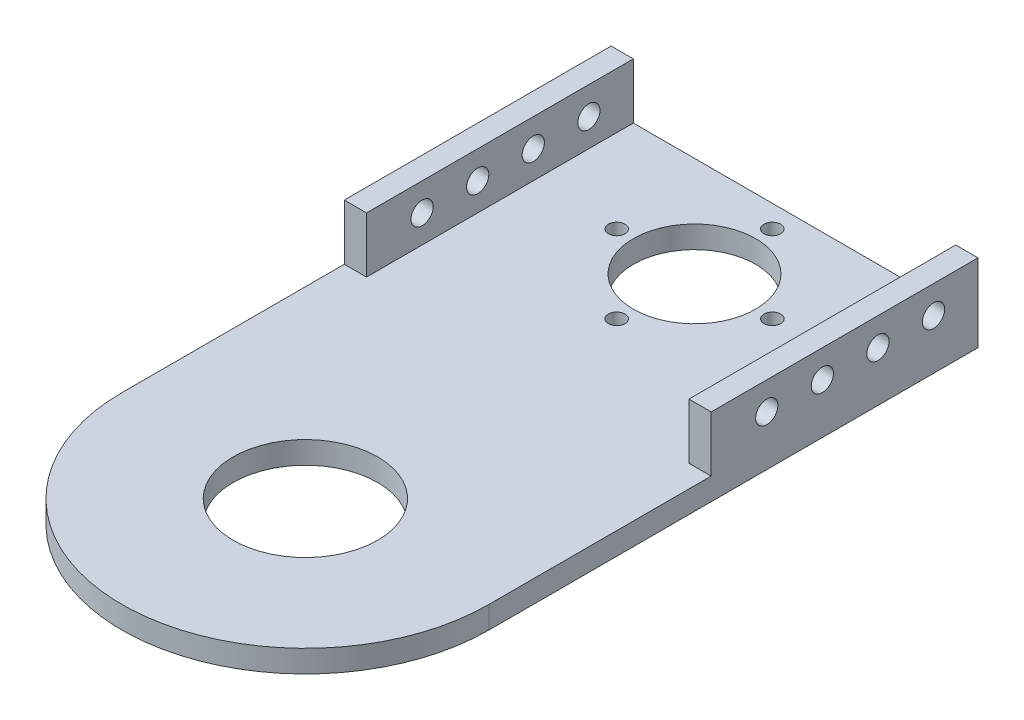
ISO-10303-21;
HEADER;
FILE_DESCRIPTION(('STEP AP214'),'2;1');
FILE_NAME('part.step','',(''),(''),'','','');
FILE_SCHEMA(('AUTOMOTIVE_DESIGN { 1 0 10303 214 1 1 1 1 }'));
ENDSEC;
DATA;
#1=APPLICATION_CONTEXT('core data for automotive mechanical design processes');
#2=APPLICATION_PROTOCOL_DEFINITION('international standard','automotive_design',2000,#1);
#3=PRODUCT_CONTEXT('',#1,'mechanical');
#4=PRODUCT('Part','Part','',(#3));
#5=PRODUCT_RELATED_PRODUCT_CATEGORY('part','',(#4));
#6=PRODUCT_DEFINITION_FORMATION('','',#4);
#7=PRODUCT_DEFINITION_CONTEXT('part definition',#1,'design');
#8=PRODUCT_DEFINITION('design','',#6,#7);
#9=PRODUCT_DEFINITION_SHAPE('','',#8);
#10=(LENGTH_UNIT() NAMED_UNIT(*) SI_UNIT(.MILLI.,.METRE.));
#11=(NAMED_UNIT(*) PLANE_ANGLE_UNIT() SI_UNIT($,.RADIAN.));
#12=(NAMED_UNIT(*) SI_UNIT($,.STERADIAN.) SOLID_ANGLE_UNIT());
#13=UNCERTAINTY_MEASURE_WITH_UNIT(LENGTH_MEASURE(1.E-05),#10,'distance_accuracy_value','');
#14=(GEOMETRIC_REPRESENTATION_CONTEXT(3) GLOBAL_UNCERTAINTY_ASSIGNED_CONTEXT((#13)) GLOBAL_UNIT_ASSIGNED_CONTEXT((#10,
#11,#12)) REPRESENTATION_CONTEXT('',''));
#15=CARTESIAN_POINT('',(0.,0.,0.));
#16=DIRECTION('',(0.,0.,1.));
#17=DIRECTION('',(1.,0.,0.));
#18=AXIS2_PLACEMENT_3D('',#15,#16,#17);
#19=CARTESIAN_POINT('',(0.,0.,30.));
#20=DIRECTION('',(0.,0.,1.));
#21=DIRECTION('',(1.,0.,0.));
#22=AXIS2_PLACEMENT_3D('',#19,#20,#21);
#23=PLANE('',#22);
#24=DIRECTION('',(-1.,0.,0.));
#25=VECTOR('',#24,1.);
#26=CARTESIAN_POINT('',(-33.,3.99999999999999,30.));
#27=LINE('',#26,#25);
#28=CARTESIAN_POINT('',(33.,3.99999999999999,30.));
#29=VERTEX_POINT('',#28);
#30=CARTESIAN_POINT('',(29.,4.,30.));
#31=VERTEX_POINT('',#30);
#32=EDGE_CURVE('E46',#29,#31,#27,.T.);
#33=ORIENTED_EDGE('',*,*,#32,.F.);
#34=DIRECTION('',(0.,1.,0.));
#35=VECTOR('',#34,1.);
#36=CARTESIAN_POINT('',(33.,0.,30.));
#37=LINE('',#36,#35);
#38=CARTESIAN_POINT('',(33.,14.,30.));
#39=VERTEX_POINT('',#38);
#40=EDGE_CURVE('E141',#29,#39,#37,.T.);
#41=ORIENTED_EDGE('',*,*,#40,.T.);
#42=DIRECTION('',(-1.,0.,0.));
#43=VECTOR('',#42,1.);
#44=CARTESIAN_POINT('',(33.,14.,30.));
#45=LINE('',#44,#43);
#46=CARTESIAN_POINT('',(29.,14.,30.));
#47=VERTEX_POINT('',#46);
#48=EDGE_CURVE('E167',#39,#47,#45,.T.);
#49=ORIENTED_EDGE('',*,*,#48,.T.);
#50=DIRECTION('',(0.,-1.,0.));
#51=VECTOR('',#50,1.);
#52=CARTESIAN_POINT('',(29.,14.,30.));
#53=LINE('',#52,#51);
#54=EDGE_CURVE('E163',#47,#31,#53,.T.);
#55=ORIENTED_EDGE('',*,*,#54,.T.);
#56=EDGE_LOOP('',(#33,#41,#49,#55));
#57=FACE_BOUND('',#56,.T.);
#58=ADVANCED_FACE('F36',(#57),#23,.T.);
#59=CARTESIAN_POINT('',(33.,14.,30.));
#60=DIRECTION('',(0.,-1.,0.));
#61=DIRECTION('',(1.,0.,0.));
#62=AXIS2_PLACEMENT_3D('',#59,#60,#61);
#63=PLANE('',#62);
#64=DIRECTION('',(0.,0.,-1.));
#65=VECTOR('',#64,1.);
#66=CARTESIAN_POINT('',(33.,14.,30.));
#67=LINE('',#66,#65);
#68=CARTESIAN_POINT('',(33.,14.,-18.));
#69=VERTEX_POINT('',#68);
#70=EDGE_CURVE('E137',#39,#69,#67,.T.);
#71=ORIENTED_EDGE('',*,*,#70,.T.);
#72=DIRECTION('',(1.,0.,0.));
#73=VECTOR('',#72,1.);
#74=CARTESIAN_POINT('',(-51.4390889145858,14.,-18.));
#75=LINE('',#74,#73);
#76=CARTESIAN_POINT('',(29.,14.,-18.));
#77=VERTEX_POINT('',#76);
#78=EDGE_CURVE('E53',#77,#69,#75,.T.);
#79=ORIENTED_EDGE('',*,*,#78,.F.);
#80=DIRECTION('',(0.,0.,-1.));
#81=VECTOR('',#80,1.);
#82=CARTESIAN_POINT('',(29.,14.,30.));
#83=LINE('',#82,#81);
#84=EDGE_CURVE('E40',#47,#77,#83,.T.);
#85=ORIENTED_EDGE('',*,*,#84,.F.);
#86=ORIENTED_EDGE('',*,*,#48,.F.);
#87=EDGE_LOOP('',(#71,#79,#85,#86));
#88=FACE_BOUND('',#87,.T.);
#89=ADVANCED_FACE('F38',(#88),#63,.F.);
#90=CARTESIAN_POINT('',(29.,14.,30.));
#91=DIRECTION('',(1.,0.,0.));
#92=DIRECTION('',(0.,1.,0.));
#93=AXIS2_PLACEMENT_3D('',#90,#91,#92);
#94=PLANE('',#93);
#95=CARTESIAN_POINT('',(29.,8.99999999999999,20.));
#96=DIRECTION('',(1.,0.,0.));
#97=DIRECTION('',(0.,1.,0.));
#98=AXIS2_PLACEMENT_3D('',#95,#96,#97);
#99=CIRCLE('',#98,2.);
#100=CARTESIAN_POINT('',(29.,11.,20.));
#101=VERTEX_POINT('',#100);
#102=EDGE_CURVE('E271',#101,#101,#99,.T.);
#103=ORIENTED_EDGE('',*,*,#102,.T.);
#104=EDGE_LOOP('',(#103));
#105=FACE_BOUND('',#104,.T.);
#106=CARTESIAN_POINT('',(29.,8.99999999999999,0.));
#107=DIRECTION('',(1.,0.,0.));
#108=DIRECTION('',(0.,1.,0.));
#109=AXIS2_PLACEMENT_3D('',#106,#107,#108);
#110=CIRCLE('',#109,2.);
#111=CARTESIAN_POINT('',(29.,11.,0.));
#112=VERTEX_POINT('',#111);
#113=EDGE_CURVE('E265',#112,#112,#110,.T.);
#114=ORIENTED_EDGE('',*,*,#113,.T.);
#115=EDGE_LOOP('',(#114));
#116=FACE_BOUND('',#115,.T.);
#117=CARTESIAN_POINT('',(29.,8.99999999999999,-10.));
#118=DIRECTION('',(1.,0.,0.));
#119=DIRECTION('',(0.,1.,0.));
#120=AXIS2_PLACEMENT_3D('',#117,#118,#119);
#121=CIRCLE('',#120,2.);
#122=CARTESIAN_POINT('',(29.,11.,-10.));
#123=VERTEX_POINT('',#122);
#124=EDGE_CURVE('E259',#123,#123,#121,.T.);
#125=ORIENTED_EDGE('',*,*,#124,.T.);
#126=EDGE_LOOP('',(#125));
#127=FACE_BOUND('',#126,.T.);
#128=CARTESIAN_POINT('',(29.,8.99999999999999,10.));
#129=DIRECTION('',(1.,0.,0.));
#130=DIRECTION('',(0.,1.,0.));
#131=AXIS2_PLACEMENT_3D('',#128,#129,#130);
#132=CIRCLE('',#131,2.);
#133=CARTESIAN_POINT('',(29.,11.,10.));
#134=VERTEX_POINT('',#133);
#135=EDGE_CURVE('E253',#134,#134,#132,.T.);
#136=ORIENTED_EDGE('',*,*,#135,.T.);
#137=EDGE_LOOP('',(#136));
#138=FACE_BOUND('',#137,.T.);
#139=ORIENTED_EDGE('',*,*,#84,.T.);
#140=DIRECTION('',(0.,-1.,0.));
#141=VECTOR('',#140,1.);
#142=CARTESIAN_POINT('',(29.,14.,-18.));
#143=LINE('',#142,#141);
#144=CARTESIAN_POINT('',(29.,4.,-18.));
#145=VERTEX_POINT('',#144);
#146=EDGE_CURVE('E162',#77,#145,#143,.T.);
#147=ORIENTED_EDGE('',*,*,#146,.T.);
#148=DIRECTION('',(0.,0.,-1.));
#149=VECTOR('',#148,1.);
#150=CARTESIAN_POINT('',(29.,4.,30.));
#151=LINE('',#150,#149);
#152=EDGE_CURVE('E152',#31,#145,#151,.T.);
#153=ORIENTED_EDGE('',*,*,#152,.F.);
#154=ORIENTED_EDGE('',*,*,#54,.F.);
#155=EDGE_LOOP('',(#139,#147,#153,#154));
#156=FACE_BOUND('',#155,.T.);
#157=ADVANCED_FACE('F161',(#105,#116,#127,#138,#156),#94,.F.);
#158=CARTESIAN_POINT('',(-29.,3.99999999999999,30.));
#159=DIRECTION('',(0.,-1.,0.));
#160=DIRECTION('',(1.,0.,0.));
#161=AXIS2_PLACEMENT_3D('',#158,#159,#160);
#162=PLANE('',#161);
#163=CARTESIAN_POINT('',(0.,4.,-14.));
#164=DIRECTION('',(0.,1.,0.));
#165=DIRECTION('',(0.,0.,1.));
#166=AXIS2_PLACEMENT_3D('',#163,#164,#165);
#167=CIRCLE('',#166,1.5);
#168=CARTESIAN_POINT('',(0.,4.,-12.5));
#169=VERTEX_POINT('',#168);
#170=EDGE_CURVE('E209',#169,#169,#167,.T.);
#171=ORIENTED_EDGE('',*,*,#170,.F.);
#172=EDGE_LOOP('',(#171));
#173=FACE_BOUND('',#172,.T.);
#174=CARTESIAN_POINT('',(14.0000000000007,4.,-7.05276754523766E-13));
#175=DIRECTION('',(0.,1.,0.));
#176=DIRECTION('',(0.,0.,1.));
#177=AXIS2_PLACEMENT_3D('',#174,#175,#176);
#178=CIRCLE('',#177,1.5);
#179=CARTESIAN_POINT('',(14.0000000000007,4.,1.49999999999929));
#180=VERTEX_POINT('',#179);
#181=EDGE_CURVE('E204',#180,#180,#178,.T.);
#182=ORIENTED_EDGE('',*,*,#181,.F.);
#183=EDGE_LOOP('',(#182));
#184=FACE_BOUND('',#183,.T.);
#185=CARTESIAN_POINT('',(1.41007496464037E-12,4.,14.));
#186=DIRECTION('',(0.,1.,0.));
#187=DIRECTION('',(0.,0.,1.));
#188=AXIS2_PLACEMENT_3D('',#185,#186,#187);
#189=CIRCLE('',#188,1.5);
#190=CARTESIAN_POINT('',(1.41007496464037E-12,4.,15.5));
#191=VERTEX_POINT('',#190);
#192=EDGE_CURVE('E197',#191,#191,#189,.T.);
#193=ORIENTED_EDGE('',*,*,#192,.F.);
#194=EDGE_LOOP('',(#193));
#195=FACE_BOUND('',#194,.T.);
#196=CARTESIAN_POINT('',(-13.9999999999993,4.,7.06991260042573E-13));
#197=DIRECTION('',(0.,1.,0.));
#198=DIRECTION('',(0.,0.,1.));
#199=AXIS2_PLACEMENT_3D('',#196,#197,#198);
#200=CIRCLE('',#199,1.5);
#201=CARTESIAN_POINT('',(-13.9999999999993,4.,1.50000000000071));
#202=VERTEX_POINT('',#201);
#203=EDGE_CURVE('E196',#202,#202,#200,.T.);
#204=ORIENTED_EDGE('',*,*,#203,.F.);
#205=EDGE_LOOP('',(#204));
#206=FACE_BOUND('',#205,.T.);
#207=CARTESIAN_POINT('',(0.,4.,0.));
#208=DIRECTION('',(0.,1.,0.));
#209=DIRECTION('',(0.,0.,1.));
#210=AXIS2_PLACEMENT_3D('',#207,#208,#209);
#211=CIRCLE('',#210,11.);
#212=CARTESIAN_POINT('',(0.,4.,11.));
#213=VERTEX_POINT('',#212);
#214=EDGE_CURVE('E216',#213,#213,#211,.T.);
#215=ORIENTED_EDGE('',*,*,#214,.F.);
#216=EDGE_LOOP('',(#215));
#217=FACE_BOUND('',#216,.T.);
#218=ORIENTED_EDGE('',*,*,#152,.T.);
#219=DIRECTION('',(-1.,0.,0.));
#220=VECTOR('',#219,1.);
#221=CARTESIAN_POINT('',(-29.,3.99999999999999,-18.));
#222=LINE('',#221,#220);
#223=CARTESIAN_POINT('',(-29.,3.99999999999999,-18.));
#224=VERTEX_POINT('',#223);
#225=EDGE_CURVE('E174',#145,#224,#222,.T.);
#226=ORIENTED_EDGE('',*,*,#225,.T.);
#227=DIRECTION('',(0.,0.,-1.));
#228=VECTOR('',#227,1.);
#229=CARTESIAN_POINT('',(-29.,3.99999999999999,30.));
#230=LINE('',#229,#228);
#231=CARTESIAN_POINT('',(-29.,3.99999999999999,30.));
#232=VERTEX_POINT('',#231);
#233=EDGE_CURVE('E150',#232,#224,#230,.T.);
#234=ORIENTED_EDGE('',*,*,#233,.F.);
#235=CARTESIAN_POINT('',(-33.,3.99999999999999,30.));
#236=VERTEX_POINT('',#235);
#237=EDGE_CURVE('E11',#232,#236,#27,.T.);
#238=ORIENTED_EDGE('',*,*,#237,.T.);
#239=DIRECTION('',(0.,0.,1.));
#240=VECTOR('',#239,1.);
#241=CARTESIAN_POINT('',(-33.,3.99999999999999,70.));
#242=LINE('',#241,#240);
#243=CARTESIAN_POINT('',(-33.,3.99999999999999,70.));
#244=VERTEX_POINT('',#243);
#245=EDGE_CURVE('E178',#236,#244,#242,.T.);
#246=ORIENTED_EDGE('',*,*,#245,.T.);
#247=CARTESIAN_POINT('',(0.,3.99999999999999,70.));
#248=DIRECTION('',(0.,-1.,0.));
#249=DIRECTION('',(1.,0.,0.));
#250=AXIS2_PLACEMENT_3D('',#247,#248,#249);
#251=CIRCLE('',#250,33.);
#252=CARTESIAN_POINT('',(33.,4.,70.));
#253=VERTEX_POINT('',#252);
#254=EDGE_CURVE('E180',#244,#253,#251,.F.);
#255=ORIENTED_EDGE('',*,*,#254,.T.);
#256=DIRECTION('',(0.,0.,-1.));
#257=VECTOR('',#256,1.);
#258=CARTESIAN_POINT('',(33.,4.,70.));
#259=LINE('',#258,#257);
#260=EDGE_CURVE('E182',#253,#29,#259,.T.);
#261=ORIENTED_EDGE('',*,*,#260,.T.);
#262=ORIENTED_EDGE('',*,*,#32,.T.);
#263=EDGE_LOOP('',(#218,#226,#234,#238,#246,#255,#261,#262));
#264=FACE_BOUND('',#263,.T.);
#265=CARTESIAN_POINT('',(0.,3.99999999999999,70.));
#266=DIRECTION('',(0.,-1.,0.));
#267=DIRECTION('',(1.,0.,0.));
#268=AXIS2_PLACEMENT_3D('',#265,#266,#267);
#269=CIRCLE('',#268,13.);
#270=CARTESIAN_POINT('',(13.,3.99999999999999,70.));
#271=VERTEX_POINT('',#270);
#272=EDGE_CURVE('E179',#271,#271,#269,.F.);
#273=ORIENTED_EDGE('',*,*,#272,.F.);
#274=EDGE_LOOP('',(#273));
#275=FACE_BOUND('',#274,.T.);
#276=ADVANCED_FACE('F281',(#173,#184,#195,#206,#217,#264,#275),#162,.F.);
#277=CARTESIAN_POINT('',(-29.,14.,30.));
#278=DIRECTION('',(-1.,0.,0.));
#279=DIRECTION('',(0.,-1.,0.));
#280=AXIS2_PLACEMENT_3D('',#277,#278,#279);
#281=PLANE('',#280);
#282=CARTESIAN_POINT('',(-29.,8.99999999999999,20.));
#283=DIRECTION('',(-1.,0.,0.));
#284=DIRECTION('',(0.,-1.,0.));
#285=AXIS2_PLACEMENT_3D('',#282,#283,#284);
#286=CIRCLE('',#285,2.);
#287=CARTESIAN_POINT('',(-29.,6.99999999999999,20.));
#288=VERTEX_POINT('',#287);
#289=EDGE_CURVE('E268',#288,#288,#286,.T.);
#290=ORIENTED_EDGE('',*,*,#289,.T.);
#291=EDGE_LOOP('',(#290));
#292=FACE_BOUND('',#291,.T.);
#293=CARTESIAN_POINT('',(-29.,8.99999999999999,0.));
#294=DIRECTION('',(-1.,0.,0.));
#295=DIRECTION('',(0.,-1.,0.));
#296=AXIS2_PLACEMENT_3D('',#293,#294,#295);
#297=CIRCLE('',#296,2.);
#298=CARTESIAN_POINT('',(-29.,6.99999999999999,0.));
#299=VERTEX_POINT('',#298);
#300=EDGE_CURVE('E262',#299,#299,#297,.T.);
#301=ORIENTED_EDGE('',*,*,#300,.T.);
#302=EDGE_LOOP('',(#301));
#303=FACE_BOUND('',#302,.T.);
#304=CARTESIAN_POINT('',(-29.,8.99999999999999,-10.));
#305=DIRECTION('',(-1.,0.,0.));
#306=DIRECTION('',(0.,-1.,0.));
#307=AXIS2_PLACEMENT_3D('',#304,#305,#306);
#308=CIRCLE('',#307,2.);
#309=CARTESIAN_POINT('',(-29.,6.99999999999999,-10.));
#310=VERTEX_POINT('',#309);
#311=EDGE_CURVE('E256',#310,#310,#308,.T.);
#312=ORIENTED_EDGE('',*,*,#311,.T.);
#313=EDGE_LOOP('',(#312));
#314=FACE_BOUND('',#313,.T.);
#315=CARTESIAN_POINT('',(-29.,8.99999999999999,10.));
#316=DIRECTION('',(-1.,0.,0.));
#317=DIRECTION('',(0.,-1.,0.));
#318=AXIS2_PLACEMENT_3D('',#315,#316,#317);
#319=CIRCLE('',#318,2.);
#320=CARTESIAN_POINT('',(-29.,6.99999999999999,10.));
#321=VERTEX_POINT('',#320);
#322=EDGE_CURVE('E234',#321,#321,#319,.T.);
#323=ORIENTED_EDGE('',*,*,#322,.T.);
#324=EDGE_LOOP('',(#323));
#325=FACE_BOUND('',#324,.T.);
#326=ORIENTED_EDGE('',*,*,#233,.T.);
#327=DIRECTION('',(0.,1.,0.));
#328=VECTOR('',#327,1.);
#329=CARTESIAN_POINT('',(-29.,14.,-18.));
#330=LINE('',#329,#328);
#331=CARTESIAN_POINT('',(-29.,14.,-18.));
#332=VERTEX_POINT('',#331);
#333=EDGE_CURVE('E171',#224,#332,#330,.T.);
#334=ORIENTED_EDGE('',*,*,#333,.T.);
#335=DIRECTION('',(0.,0.,-1.));
#336=VECTOR('',#335,1.);
#337=CARTESIAN_POINT('',(-29.,14.,30.));
#338=LINE('',#337,#336);
#339=CARTESIAN_POINT('',(-29.,14.,30.));
#340=VERTEX_POINT('',#339);
#341=EDGE_CURVE('E147',#340,#332,#338,.T.);
#342=ORIENTED_EDGE('',*,*,#341,.F.);
#343=DIRECTION('',(0.,1.,0.));
#344=VECTOR('',#343,1.);
#345=CARTESIAN_POINT('',(-29.,14.,30.));
#346=LINE('',#345,#344);
#347=EDGE_CURVE('E276',#232,#340,#346,.T.);
#348=ORIENTED_EDGE('',*,*,#347,.F.);
#349=EDGE_LOOP('',(#326,#334,#342,#348));
#350=FACE_BOUND('',#349,.T.);
#351=ADVANCED_FACE('F299',(#292,#303,#314,#325,#350),#281,.F.);
#352=CARTESIAN_POINT('',(-33.,14.,30.));
#353=DIRECTION('',(0.,-1.,0.));
#354=DIRECTION('',(0.,0.,-1.));
#355=AXIS2_PLACEMENT_3D('',#352,#353,#354);
#356=PLANE('',#355);
#357=ORIENTED_EDGE('',*,*,#341,.T.);
#358=CARTESIAN_POINT('',(-33.,14.,-18.));
#359=VERTEX_POINT('',#358);
#360=EDGE_CURVE('E130',#359,#332,#75,.T.);
#361=ORIENTED_EDGE('',*,*,#360,.F.);
#362=DIRECTION('',(0.,0.,-1.));
#363=VECTOR('',#362,1.);
#364=CARTESIAN_POINT('',(-33.,14.,30.));
#365=LINE('',#364,#363);
#366=CARTESIAN_POINT('',(-33.,14.,30.));
#367=VERTEX_POINT('',#366);
#368=EDGE_CURVE('E139',#367,#359,#365,.T.);
#369=ORIENTED_EDGE('',*,*,#368,.F.);
#370=DIRECTION('',(-1.,0.,0.));
#371=VECTOR('',#370,1.);
#372=CARTESIAN_POINT('',(-33.,14.,30.));
#373=LINE('',#372,#371);
#374=EDGE_CURVE('E278',#340,#367,#373,.T.);
#375=ORIENTED_EDGE('',*,*,#374,.F.);
#376=EDGE_LOOP('',(#357,#361,#369,#375));
#377=FACE_BOUND('',#376,.T.);
#378=ADVANCED_FACE('F294',(#377),#356,.F.);
#379=CARTESIAN_POINT('',(-33.,0.,30.));
#380=DIRECTION('',(1.,0.,0.));
#381=DIRECTION('',(0.,0.,-1.));
#382=AXIS2_PLACEMENT_3D('',#379,#380,#381);
#383=PLANE('',#382);
#384=CARTESIAN_POINT('',(-33.,8.99999999999999,20.));
#385=DIRECTION('',(1.,0.,0.));
#386=DIRECTION('',(0.,0.,-1.));
#387=AXIS2_PLACEMENT_3D('',#384,#385,#386);
#388=CIRCLE('',#387,2.);
#389=CARTESIAN_POINT('',(-33.,8.99999999999999,18.));
#390=VERTEX_POINT('',#389);
#391=EDGE_CURVE('E230',#390,#390,#388,.F.);
#392=ORIENTED_EDGE('',*,*,#391,.F.);
#393=EDGE_LOOP('',(#392));
#394=FACE_BOUND('',#393,.T.);
#395=CARTESIAN_POINT('',(-33.,8.99999999999999,0.));
#396=DIRECTION('',(1.,0.,0.));
#397=DIRECTION('',(0.,0.,-1.));
#398=AXIS2_PLACEMENT_3D('',#395,#396,#397);
#399=CIRCLE('',#398,2.);
#400=CARTESIAN_POINT('',(-33.,8.99999999999999,-2.));
#401=VERTEX_POINT('',#400);
#402=EDGE_CURVE('E237',#401,#401,#399,.F.);
#403=ORIENTED_EDGE('',*,*,#402,.F.);
#404=EDGE_LOOP('',(#403));
#405=FACE_BOUND('',#404,.T.);
#406=CARTESIAN_POINT('',(-33.,8.99999999999999,-10.));
#407=DIRECTION('',(1.,0.,0.));
#408=DIRECTION('',(0.,0.,-1.));
#409=AXIS2_PLACEMENT_3D('',#406,#407,#408);
#410=CIRCLE('',#409,2.);
#411=CARTESIAN_POINT('',(-33.,8.99999999999999,-12.));
#412=VERTEX_POINT('',#411);
#413=EDGE_CURVE('E244',#412,#412,#410,.F.);
#414=ORIENTED_EDGE('',*,*,#413,.F.);
#415=EDGE_LOOP('',(#414));
#416=FACE_BOUND('',#415,.T.);
#417=CARTESIAN_POINT('',(-33.,8.99999999999999,10.));
#418=DIRECTION('',(1.,0.,0.));
#419=DIRECTION('',(0.,0.,-1.));
#420=AXIS2_PLACEMENT_3D('',#417,#418,#419);
#421=CIRCLE('',#420,2.);
#422=CARTESIAN_POINT('',(-33.,8.99999999999999,8.));
#423=VERTEX_POINT('',#422);
#424=EDGE_CURVE('E231',#423,#423,#421,.F.);
#425=ORIENTED_EDGE('',*,*,#424,.F.);
#426=EDGE_LOOP('',(#425));
#427=FACE_BOUND('',#426,.T.);
#428=ORIENTED_EDGE('',*,*,#368,.T.);
#429=DIRECTION('',(0.,1.,0.));
#430=VECTOR('',#429,1.);
#431=CARTESIAN_POINT('',(-33.,14.,-18.));
#432=LINE('',#431,#430);
#433=CARTESIAN_POINT('',(-33.,0.,-18.));
#434=VERTEX_POINT('',#433);
#435=EDGE_CURVE('E129',#434,#359,#432,.T.);
#436=ORIENTED_EDGE('',*,*,#435,.F.);
#437=DIRECTION('',(0.,0.,-1.));
#438=VECTOR('',#437,1.);
#439=CARTESIAN_POINT('',(-33.,0.,30.));
#440=LINE('',#439,#438);
#441=CARTESIAN_POINT('',(-33.,0.,70.));
#442=VERTEX_POINT('',#441);
#443=EDGE_CURVE('E128',#442,#434,#440,.T.);
#444=ORIENTED_EDGE('',*,*,#443,.F.);
#445=DIRECTION('',(0.,-1.,0.));
#446=VECTOR('',#445,1.);
#447=CARTESIAN_POINT('',(-33.,102.412397592986,70.));
#448=LINE('',#447,#446);
#449=EDGE_CURVE('E190',#244,#442,#448,.T.);
#450=ORIENTED_EDGE('',*,*,#449,.F.);
#451=ORIENTED_EDGE('',*,*,#245,.F.);
#452=DIRECTION('',(0.,-1.,0.));
#453=VECTOR('',#452,1.);
#454=CARTESIAN_POINT('',(-33.,0.,30.));
#455=LINE('',#454,#453);
#456=EDGE_CURVE('E280',#367,#236,#455,.T.);
#457=ORIENTED_EDGE('',*,*,#456,.F.);
#458=EDGE_LOOP('',(#428,#436,#444,#450,#451,#457));
#459=FACE_BOUND('',#458,.T.);
#460=ADVANCED_FACE('F289',(#394,#405,#416,#427,#459),#383,.F.);
#461=CARTESIAN_POINT('',(33.,0.,30.));
#462=DIRECTION('',(0.,1.,0.));
#463=DIRECTION('',(-1.,0.,0.));
#464=AXIS2_PLACEMENT_3D('',#461,#462,#463);
#465=PLANE('',#464);
#466=CARTESIAN_POINT('',(0.,0.,-14.));
#467=DIRECTION('',(0.,1.,0.));
#468=DIRECTION('',(-1.,0.,0.));
#469=AXIS2_PLACEMENT_3D('',#466,#467,#468);
#470=CIRCLE('',#469,1.5);
#471=CARTESIAN_POINT('',(-1.5,0.,-14.));
#472=VERTEX_POINT('',#471);
#473=EDGE_CURVE('E212',#472,#472,#470,.F.);
#474=ORIENTED_EDGE('',*,*,#473,.F.);
#475=EDGE_LOOP('',(#474));
#476=FACE_BOUND('',#475,.T.);
#477=CARTESIAN_POINT('',(14.0000000000007,0.,-7.05276754523766E-13));
#478=DIRECTION('',(0.,1.,0.));
#479=DIRECTION('',(-1.,0.,0.));
#480=AXIS2_PLACEMENT_3D('',#477,#478,#479);
#481=CIRCLE('',#480,1.5);
#482=CARTESIAN_POINT('',(12.5000000000007,0.,-7.05276754523766E-13));
#483=VERTEX_POINT('',#482);
#484=EDGE_CURVE('E213',#483,#483,#481,.F.);
#485=ORIENTED_EDGE('',*,*,#484,.F.);
#486=EDGE_LOOP('',(#485));
#487=FACE_BOUND('',#486,.T.);
#488=CARTESIAN_POINT('',(1.41007496464037E-12,0.,14.));
#489=DIRECTION('',(0.,1.,0.));
#490=DIRECTION('',(-1.,0.,0.));
#491=AXIS2_PLACEMENT_3D('',#488,#489,#490);
#492=CIRCLE('',#491,1.5);
#493=CARTESIAN_POINT('',(-1.49999999999859,0.,14.));
#494=VERTEX_POINT('',#493);
#495=EDGE_CURVE('E200',#494,#494,#492,.F.);
#496=ORIENTED_EDGE('',*,*,#495,.F.);
#497=EDGE_LOOP('',(#496));
#498=FACE_BOUND('',#497,.T.);
#499=CARTESIAN_POINT('',(-13.9999999999993,0.,7.06991260042573E-13));
#500=DIRECTION('',(0.,1.,0.));
#501=DIRECTION('',(-1.,0.,0.));
#502=AXIS2_PLACEMENT_3D('',#499,#500,#501);
#503=CIRCLE('',#502,1.5);
#504=CARTESIAN_POINT('',(-15.4999999999993,0.,7.06991260042573E-13));
#505=VERTEX_POINT('',#504);
#506=EDGE_CURVE('E201',#505,#505,#503,.F.);
#507=ORIENTED_EDGE('',*,*,#506,.F.);
#508=EDGE_LOOP('',(#507));
#509=FACE_BOUND('',#508,.T.);
#510=CARTESIAN_POINT('',(0.,0.,0.));
#511=DIRECTION('',(0.,1.,0.));
#512=DIRECTION('',(-1.,0.,0.));
#513=AXIS2_PLACEMENT_3D('',#510,#511,#512);
#514=CIRCLE('',#513,11.);
#515=CARTESIAN_POINT('',(-11.,0.,0.));
#516=VERTEX_POINT('',#515);
#517=EDGE_CURVE('E223',#516,#516,#514,.F.);
#518=ORIENTED_EDGE('',*,*,#517,.F.);
#519=EDGE_LOOP('',(#518));
#520=FACE_BOUND('',#519,.T.);
#521=ORIENTED_EDGE('',*,*,#443,.T.);
#522=DIRECTION('',(1.,0.,0.));
#523=VECTOR('',#522,1.);
#524=CARTESIAN_POINT('',(-51.4390889145858,0.,-18.));
#525=LINE('',#524,#523);
#526=CARTESIAN_POINT('',(33.,0.,-18.));
#527=VERTEX_POINT('',#526);
#528=EDGE_CURVE('E114',#434,#527,#525,.T.);
#529=ORIENTED_EDGE('',*,*,#528,.T.);
#530=DIRECTION('',(0.,0.,-1.));
#531=VECTOR('',#530,1.);
#532=CARTESIAN_POINT('',(33.,0.,30.));
#533=LINE('',#532,#531);
#534=CARTESIAN_POINT('',(33.,0.,70.));
#535=VERTEX_POINT('',#534);
#536=EDGE_CURVE('E126',#535,#527,#533,.T.);
#537=ORIENTED_EDGE('',*,*,#536,.F.);
#538=CARTESIAN_POINT('',(0.,0.,70.));
#539=DIRECTION('',(0.,-1.,0.));
#540=DIRECTION('',(0.,0.,-1.));
#541=AXIS2_PLACEMENT_3D('',#538,#539,#540);
#542=CIRCLE('',#541,33.);
#543=EDGE_CURVE('E188',#535,#442,#542,.T.);
#544=ORIENTED_EDGE('',*,*,#543,.T.);
#545=EDGE_LOOP('',(#521,#529,#537,#544));
#546=FACE_BOUND('',#545,.T.);
#547=CARTESIAN_POINT('',(0.,0.,70.));
#548=DIRECTION('',(0.,-1.,0.));
#549=DIRECTION('',(0.,0.,-1.));
#550=AXIS2_PLACEMENT_3D('',#547,#548,#549);
#551=CIRCLE('',#550,13.);
#552=CARTESIAN_POINT('',(0.,0.,57.));
#553=VERTEX_POINT('',#552);
#554=EDGE_CURVE('E177',#553,#553,#551,.T.);
#555=ORIENTED_EDGE('',*,*,#554,.F.);
#556=EDGE_LOOP('',(#555));
#557=FACE_BOUND('',#556,.T.);
#558=ADVANCED_FACE('F123',(#476,#487,#498,#509,#520,#546,#557),#465,.F.);
#559=CARTESIAN_POINT('',(33.,0.,30.));
#560=DIRECTION('',(-1.,0.,0.));
#561=DIRECTION('',(0.,0.,1.));
#562=AXIS2_PLACEMENT_3D('',#559,#560,#561);
#563=PLANE('',#562);
#564=CARTESIAN_POINT('',(33.,8.99999999999999,20.));
#565=DIRECTION('',(1.,0.,0.));
#566=DIRECTION('',(0.,0.,-1.));
#567=AXIS2_PLACEMENT_3D('',#564,#565,#566);
#568=CIRCLE('',#567,2.);
#569=CARTESIAN_POINT('',(33.,8.99999999999999,18.));
#570=VERTEX_POINT('',#569);
#571=EDGE_CURVE('E227',#570,#570,#568,.T.);
#572=ORIENTED_EDGE('',*,*,#571,.F.);
#573=EDGE_LOOP('',(#572));
#574=FACE_BOUND('',#573,.T.);
#575=CARTESIAN_POINT('',(33.,8.99999999999999,0.));
#576=DIRECTION('',(1.,0.,0.));
#577=DIRECTION('',(0.,0.,-1.));
#578=AXIS2_PLACEMENT_3D('',#575,#576,#577);
#579=CIRCLE('',#578,2.);
#580=CARTESIAN_POINT('',(33.,8.99999999999999,-2.));
#581=VERTEX_POINT('',#580);
#582=EDGE_CURVE('E226',#581,#581,#579,.T.);
#583=ORIENTED_EDGE('',*,*,#582,.F.);
#584=EDGE_LOOP('',(#583));
#585=FACE_BOUND('',#584,.T.);
#586=CARTESIAN_POINT('',(33.,8.99999999999999,-10.));
#587=DIRECTION('',(1.,0.,0.));
#588=DIRECTION('',(0.,0.,1.));
#589=AXIS2_PLACEMENT_3D('',#586,#587,#588);
#590=CIRCLE('',#589,2.);
#591=CARTESIAN_POINT('',(33.,8.99999999999999,-8.));
#592=VERTEX_POINT('',#591);
#593=EDGE_CURVE('E240',#592,#592,#590,.T.);
#594=ORIENTED_EDGE('',*,*,#593,.F.);
#595=EDGE_LOOP('',(#594));
#596=FACE_BOUND('',#595,.T.);
#597=CARTESIAN_POINT('',(33.,8.99999999999999,10.));
#598=DIRECTION('',(1.,0.,0.));
#599=DIRECTION('',(0.,0.,-1.));
#600=AXIS2_PLACEMENT_3D('',#597,#598,#599);
#601=CIRCLE('',#600,2.);
#602=CARTESIAN_POINT('',(33.,8.99999999999999,8.));
#603=VERTEX_POINT('',#602);
#604=EDGE_CURVE('E241',#603,#603,#601,.T.);
#605=ORIENTED_EDGE('',*,*,#604,.F.);
#606=EDGE_LOOP('',(#605));
#607=FACE_BOUND('',#606,.T.);
#608=ORIENTED_EDGE('',*,*,#536,.T.);
#609=DIRECTION('',(0.,-1.,0.));
#610=VECTOR('',#609,1.);
#611=CARTESIAN_POINT('',(33.,14.,-18.));
#612=LINE('',#611,#610);
#613=EDGE_CURVE('E111',#69,#527,#612,.T.);
#614=ORIENTED_EDGE('',*,*,#613,.F.);
#615=ORIENTED_EDGE('',*,*,#70,.F.);
#616=ORIENTED_EDGE('',*,*,#40,.F.);
#617=ORIENTED_EDGE('',*,*,#260,.F.);
#618=DIRECTION('',(0.,-1.,0.));
#619=VECTOR('',#618,1.);
#620=CARTESIAN_POINT('',(33.,102.412397592986,70.));
#621=LINE('',#620,#619);
#622=EDGE_CURVE('E135',#253,#535,#621,.T.);
#623=ORIENTED_EDGE('',*,*,#622,.T.);
#624=EDGE_LOOP('',(#608,#614,#615,#616,#617,#623));
#625=FACE_BOUND('',#624,.T.);
#626=ADVANCED_FACE('F132',(#574,#585,#596,#607,#625),#563,.F.);
#627=ORIENTED_EDGE('',*,*,#237,.F.);
#628=ORIENTED_EDGE('',*,*,#347,.T.);
#629=ORIENTED_EDGE('',*,*,#374,.T.);
#630=ORIENTED_EDGE('',*,*,#456,.T.);
#631=EDGE_LOOP('',(#627,#628,#629,#630));
#632=FACE_BOUND('',#631,.T.);
#633=ADVANCED_FACE('F302',(#632),#23,.T.);
#634=CARTESIAN_POINT('',(-38.6568542494924,8.99999999999999,10.));
#635=DIRECTION('',(1.,0.,0.));
#636=DIRECTION('',(0.,0.,-1.));
#637=AXIS2_PLACEMENT_3D('',#634,#635,#636);
#638=CYLINDRICAL_SURFACE('',#637,2.);
#639=ORIENTED_EDGE('',*,*,#604,.T.);
#640=EDGE_LOOP('',(#639));
#641=FACE_BOUND('',#640,.T.);
#642=ORIENTED_EDGE('',*,*,#135,.F.);
#643=EDGE_LOOP('',(#642));
#644=FACE_BOUND('',#643,.T.);
#645=ADVANCED_FACE('F304',(#641,#644),#638,.F.);
#646=CARTESIAN_POINT('',(-38.6568542494924,8.99999999999999,-10.));
#647=DIRECTION('',(1.,0.,0.));
#648=DIRECTION('',(0.,0.,-1.));
#649=AXIS2_PLACEMENT_3D('',#646,#647,#648);
#650=CYLINDRICAL_SURFACE('',#649,2.);
#651=ORIENTED_EDGE('',*,*,#593,.T.);
#652=EDGE_LOOP('',(#651));
#653=FACE_BOUND('',#652,.T.);
#654=ORIENTED_EDGE('',*,*,#124,.F.);
#655=EDGE_LOOP('',(#654));
#656=FACE_BOUND('',#655,.T.);
#657=ADVANCED_FACE('F310',(#653,#656),#650,.F.);
#658=CARTESIAN_POINT('',(-38.6568542494924,8.99999999999999,0.));
#659=DIRECTION('',(1.,0.,0.));
#660=DIRECTION('',(0.,0.,-1.));
#661=AXIS2_PLACEMENT_3D('',#658,#659,#660);
#662=CYLINDRICAL_SURFACE('',#661,2.);
#663=ORIENTED_EDGE('',*,*,#582,.T.);
#664=EDGE_LOOP('',(#663));
#665=FACE_BOUND('',#664,.T.);
#666=ORIENTED_EDGE('',*,*,#113,.F.);
#667=EDGE_LOOP('',(#666));
#668=FACE_BOUND('',#667,.T.);
#669=ADVANCED_FACE('F378',(#665,#668),#662,.F.);
#670=CARTESIAN_POINT('',(-38.6568542494924,8.99999999999999,20.));
#671=DIRECTION('',(1.,0.,0.));
#672=DIRECTION('',(0.,0.,-1.));
#673=AXIS2_PLACEMENT_3D('',#670,#671,#672);
#674=CYLINDRICAL_SURFACE('',#673,2.);
#675=ORIENTED_EDGE('',*,*,#571,.T.);
#676=EDGE_LOOP('',(#675));
#677=FACE_BOUND('',#676,.T.);
#678=ORIENTED_EDGE('',*,*,#102,.F.);
#679=EDGE_LOOP('',(#678));
#680=FACE_BOUND('',#679,.T.);
#681=ADVANCED_FACE('F372',(#677,#680),#674,.F.);
#682=ORIENTED_EDGE('',*,*,#424,.T.);
#683=EDGE_LOOP('',(#682));
#684=FACE_BOUND('',#683,.T.);
#685=ORIENTED_EDGE('',*,*,#322,.F.);
#686=EDGE_LOOP('',(#685));
#687=FACE_BOUND('',#686,.T.);
#688=ADVANCED_FACE('F313',(#684,#687),#638,.F.);
#689=ORIENTED_EDGE('',*,*,#413,.T.);
#690=EDGE_LOOP('',(#689));
#691=FACE_BOUND('',#690,.T.);
#692=ORIENTED_EDGE('',*,*,#311,.F.);
#693=EDGE_LOOP('',(#692));
#694=FACE_BOUND('',#693,.T.);
#695=ADVANCED_FACE('F384',(#691,#694),#650,.F.);
#696=ORIENTED_EDGE('',*,*,#402,.T.);
#697=EDGE_LOOP('',(#696));
#698=FACE_BOUND('',#697,.T.);
#699=ORIENTED_EDGE('',*,*,#300,.F.);
#700=EDGE_LOOP('',(#699));
#701=FACE_BOUND('',#700,.T.);
#702=ADVANCED_FACE('F369',(#698,#701),#662,.F.);
#703=ORIENTED_EDGE('',*,*,#391,.T.);
#704=EDGE_LOOP('',(#703));
#705=FACE_BOUND('',#704,.T.);
#706=ORIENTED_EDGE('',*,*,#289,.F.);
#707=EDGE_LOOP('',(#706));
#708=FACE_BOUND('',#707,.T.);
#709=ADVANCED_FACE('F358',(#705,#708),#674,.F.);
#710=CARTESIAN_POINT('',(0.,-31.1126983722081,0.));
#711=DIRECTION('',(0.,1.,0.));
#712=DIRECTION('',(0.,0.,1.));
#713=AXIS2_PLACEMENT_3D('',#710,#711,#712);
#714=CYLINDRICAL_SURFACE('',#713,11.);
#715=ORIENTED_EDGE('',*,*,#517,.T.);
#716=EDGE_LOOP('',(#715));
#717=FACE_BOUND('',#716,.T.);
#718=ORIENTED_EDGE('',*,*,#214,.T.);
#719=EDGE_LOOP('',(#718));
#720=FACE_BOUND('',#719,.T.);
#721=ADVANCED_FACE('F354',(#717,#720),#714,.F.);
#722=CARTESIAN_POINT('',(-13.9999999999993,-31.1126983722081,7.06991260042573E-13));
#723=DIRECTION('',(0.,1.,0.));
#724=DIRECTION('',(0.,0.,1.));
#725=AXIS2_PLACEMENT_3D('',#722,#723,#724);
#726=CYLINDRICAL_SURFACE('',#725,1.5);
#727=ORIENTED_EDGE('',*,*,#506,.T.);
#728=EDGE_LOOP('',(#727));
#729=FACE_BOUND('',#728,.T.);
#730=ORIENTED_EDGE('',*,*,#203,.T.);
#731=EDGE_LOOP('',(#730));
#732=FACE_BOUND('',#731,.T.);
#733=ADVANCED_FACE('F357',(#729,#732),#726,.F.);
#734=CARTESIAN_POINT('',(1.41007496464037E-12,-31.1126983722081,14.));
#735=DIRECTION('',(0.,1.,0.));
#736=DIRECTION('',(0.,0.,1.));
#737=AXIS2_PLACEMENT_3D('',#734,#735,#736);
#738=CYLINDRICAL_SURFACE('',#737,1.5);
#739=ORIENTED_EDGE('',*,*,#495,.T.);
#740=EDGE_LOOP('',(#739));
#741=FACE_BOUND('',#740,.T.);
#742=ORIENTED_EDGE('',*,*,#192,.T.);
#743=EDGE_LOOP('',(#742));
#744=FACE_BOUND('',#743,.T.);
#745=ADVANCED_FACE('F366',(#741,#744),#738,.F.);
#746=CARTESIAN_POINT('',(14.0000000000007,-31.1126983722081,-7.05276754523766E-13));
#747=DIRECTION('',(0.,1.,0.));
#748=DIRECTION('',(0.,0.,1.));
#749=AXIS2_PLACEMENT_3D('',#746,#747,#748);
#750=CYLINDRICAL_SURFACE('',#749,1.5);
#751=ORIENTED_EDGE('',*,*,#484,.T.);
#752=EDGE_LOOP('',(#751));
#753=FACE_BOUND('',#752,.T.);
#754=ORIENTED_EDGE('',*,*,#181,.T.);
#755=EDGE_LOOP('',(#754));
#756=FACE_BOUND('',#755,.T.);
#757=ADVANCED_FACE('F374',(#753,#756),#750,.F.);
#758=CARTESIAN_POINT('',(0.,-31.1126983722081,-14.));
#759=DIRECTION('',(0.,1.,0.));
#760=DIRECTION('',(0.,0.,1.));
#761=AXIS2_PLACEMENT_3D('',#758,#759,#760);
#762=CYLINDRICAL_SURFACE('',#761,1.5);
#763=ORIENTED_EDGE('',*,*,#473,.T.);
#764=EDGE_LOOP('',(#763));
#765=FACE_BOUND('',#764,.T.);
#766=ORIENTED_EDGE('',*,*,#170,.T.);
#767=EDGE_LOOP('',(#766));
#768=FACE_BOUND('',#767,.T.);
#769=ADVANCED_FACE('F496',(#765,#768),#762,.F.);
#770=CARTESIAN_POINT('',(0.,102.412397592986,70.));
#771=DIRECTION('',(0.,-1.,0.));
#772=DIRECTION('',(0.,0.,-1.));
#773=AXIS2_PLACEMENT_3D('',#770,#771,#772);
#774=CYLINDRICAL_SURFACE('',#773,33.);
#775=ORIENTED_EDGE('',*,*,#254,.F.);
#776=ORIENTED_EDGE('',*,*,#449,.T.);
#777=ORIENTED_EDGE('',*,*,#543,.F.);
#778=ORIENTED_EDGE('',*,*,#622,.F.);
#779=EDGE_LOOP('',(#775,#776,#777,#778));
#780=FACE_BOUND('',#779,.T.);
#781=ADVANCED_FACE('F287',(#780),#774,.T.);
#782=CARTESIAN_POINT('',(0.,102.412397592986,70.));
#783=DIRECTION('',(0.,-1.,0.));
#784=DIRECTION('',(0.,0.,-1.));
#785=AXIS2_PLACEMENT_3D('',#782,#783,#784);
#786=CYLINDRICAL_SURFACE('',#785,13.);
#787=ORIENTED_EDGE('',*,*,#272,.T.);
#788=EDGE_LOOP('',(#787));
#789=FACE_BOUND('',#788,.T.);
#790=ORIENTED_EDGE('',*,*,#554,.T.);
#791=EDGE_LOOP('',(#790));
#792=FACE_BOUND('',#791,.T.);
#793=ADVANCED_FACE('F483',(#789,#792),#786,.F.);
#794=CARTESIAN_POINT('',(-51.4390889145858,14.,-18.));
#795=DIRECTION('',(0.,0.,1.));
#796=DIRECTION('',(1.,0.,0.));
#797=AXIS2_PLACEMENT_3D('',#794,#795,#796);
#798=PLANE('',#797);
#799=ORIENTED_EDGE('',*,*,#78,.T.);
#800=ORIENTED_EDGE('',*,*,#613,.T.);
#801=ORIENTED_EDGE('',*,*,#528,.F.);
#802=ORIENTED_EDGE('',*,*,#435,.T.);
#803=ORIENTED_EDGE('',*,*,#360,.T.);
#804=ORIENTED_EDGE('',*,*,#333,.F.);
#805=ORIENTED_EDGE('',*,*,#225,.F.);
#806=ORIENTED_EDGE('',*,*,#146,.F.);
#807=EDGE_LOOP('',(#799,#800,#801,#802,#803,#804,#805,#806));
#808=FACE_BOUND('',#807,.T.);
#809=ADVANCED_FACE('F113',(#808),#798,.F.);
#810=CLOSED_SHELL('',(#58,#89,#157,#276,#351,#378,#460,#558,#626,#633,#645,#657,#669,#681,#688,
#695,#702,#709,#721,#733,#745,#757,#769,#781,#793,#809));
#811=MANIFOLD_SOLID_BREP('B2',#810);
#812=ADVANCED_BREP_SHAPE_REPRESENTATION('',(#18,#811),#14);
#813=SHAPE_DEFINITION_REPRESENTATION(#9,#812);
ENDSEC;
END-ISO-10303-21;
